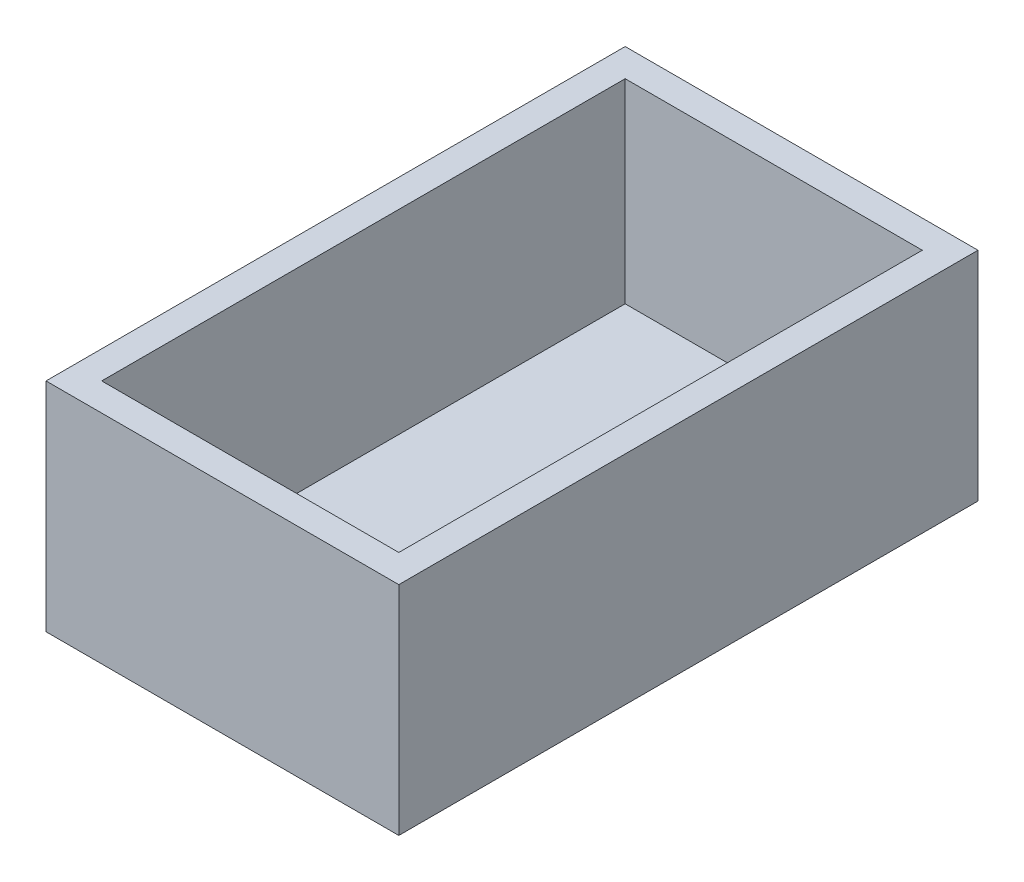
ISO-10303-21;
HEADER;
FILE_DESCRIPTION(('STEP AP214'),'2;1');
FILE_NAME('part.step','',(''),(''),'','','');
FILE_SCHEMA(('AUTOMOTIVE_DESIGN { 1 0 10303 214 1 1 1 1 }'));
ENDSEC;
DATA;
#1=APPLICATION_CONTEXT('core data for automotive mechanical design processes');
#2=APPLICATION_PROTOCOL_DEFINITION('international standard','automotive_design',2000,#1);
#3=PRODUCT_CONTEXT('',#1,'mechanical');
#4=PRODUCT('Part','Part','',(#3));
#5=PRODUCT_RELATED_PRODUCT_CATEGORY('part','',(#4));
#6=PRODUCT_DEFINITION_FORMATION('','',#4);
#7=PRODUCT_DEFINITION_CONTEXT('part definition',#1,'design');
#8=PRODUCT_DEFINITION('design','',#6,#7);
#9=PRODUCT_DEFINITION_SHAPE('','',#8);
#10=(LENGTH_UNIT() NAMED_UNIT(*) SI_UNIT(.MILLI.,.METRE.));
#11=(NAMED_UNIT(*) PLANE_ANGLE_UNIT() SI_UNIT($,.RADIAN.));
#12=(NAMED_UNIT(*) SI_UNIT($,.STERADIAN.) SOLID_ANGLE_UNIT());
#13=UNCERTAINTY_MEASURE_WITH_UNIT(LENGTH_MEASURE(1.E-05),#10,'distance_accuracy_value','');
#14=(GEOMETRIC_REPRESENTATION_CONTEXT(3) GLOBAL_UNCERTAINTY_ASSIGNED_CONTEXT((#13)) GLOBAL_UNIT_ASSIGNED_CONTEXT((#10,
#11,#12)) REPRESENTATION_CONTEXT('',''));
#15=CARTESIAN_POINT('',(0.,0.,0.));
#16=DIRECTION('',(0.,0.,1.));
#17=DIRECTION('',(1.,0.,0.));
#18=AXIS2_PLACEMENT_3D('',#15,#16,#17);
#19=CARTESIAN_POINT('',(0.,4.,0.));
#20=DIRECTION('',(1.,0.,0.));
#21=DIRECTION('',(0.,0.,-1.));
#22=AXIS2_PLACEMENT_3D('',#19,#20,#21);
#23=PLANE('',#22);
#24=DIRECTION('',(0.,0.,1.));
#25=VECTOR('',#24,1.);
#26=CARTESIAN_POINT('',(0.,0.,0.));
#27=LINE('',#26,#25);
#28=CARTESIAN_POINT('',(0.,0.,-103.98));
#29=VERTEX_POINT('',#28);
#30=CARTESIAN_POINT('',(0.,0.,0.));
#31=VERTEX_POINT('',#30);
#32=EDGE_CURVE('E173',#29,#31,#27,.T.);
#33=ORIENTED_EDGE('',*,*,#32,.T.);
#34=DIRECTION('',(0.,-1.,0.));
#35=VECTOR('',#34,1.);
#36=CARTESIAN_POINT('',(0.,4.,0.));
#37=LINE('',#36,#35);
#38=CARTESIAN_POINT('',(0.,39.,0.));
#39=VERTEX_POINT('',#38);
#40=EDGE_CURVE('E11',#39,#31,#37,.T.);
#41=ORIENTED_EDGE('',*,*,#40,.F.);
#42=DIRECTION('',(0.,0.,1.));
#43=VECTOR('',#42,1.);
#44=CARTESIAN_POINT('',(0.,39.,-103.98));
#45=LINE('',#44,#43);
#46=CARTESIAN_POINT('',(0.,39.,-103.98));
#47=VERTEX_POINT('',#46);
#48=EDGE_CURVE('E124',#47,#39,#45,.T.);
#49=ORIENTED_EDGE('',*,*,#48,.F.);
#50=DIRECTION('',(0.,-1.,0.));
#51=VECTOR('',#50,1.);
#52=CARTESIAN_POINT('',(0.,4.,-103.98));
#53=LINE('',#52,#51);
#54=EDGE_CURVE('E185',#47,#29,#53,.T.);
#55=ORIENTED_EDGE('',*,*,#54,.T.);
#56=EDGE_LOOP('',(#33,#41,#49,#55));
#57=FACE_BOUND('',#56,.T.);
#58=ADVANCED_FACE('F39',(#57),#23,.F.);
#59=CARTESIAN_POINT('',(0.,4.,0.));
#60=DIRECTION('',(0.,0.,-1.));
#61=DIRECTION('',(-1.,0.,0.));
#62=AXIS2_PLACEMENT_3D('',#59,#60,#61);
#63=PLANE('',#62);
#64=DIRECTION('',(1.,0.,0.));
#65=VECTOR('',#64,1.);
#66=CARTESIAN_POINT('',(0.,0.,0.));
#67=LINE('',#66,#65);
#68=CARTESIAN_POINT('',(63.34,0.,0.));
#69=VERTEX_POINT('',#68);
#70=EDGE_CURVE('E177',#31,#69,#67,.T.);
#71=ORIENTED_EDGE('',*,*,#70,.T.);
#72=DIRECTION('',(0.,-1.,0.));
#73=VECTOR('',#72,1.);
#74=CARTESIAN_POINT('',(63.34,4.,0.));
#75=LINE('',#74,#73);
#76=CARTESIAN_POINT('',(63.34,39.,0.));
#77=VERTEX_POINT('',#76);
#78=EDGE_CURVE('E47',#77,#69,#75,.T.);
#79=ORIENTED_EDGE('',*,*,#78,.F.);
#80=DIRECTION('',(1.,0.,0.));
#81=VECTOR('',#80,1.);
#82=CARTESIAN_POINT('',(0.,39.,0.));
#83=LINE('',#82,#81);
#84=EDGE_CURVE('E161',#39,#77,#83,.T.);
#85=ORIENTED_EDGE('',*,*,#84,.F.);
#86=ORIENTED_EDGE('',*,*,#40,.T.);
#87=EDGE_LOOP('',(#71,#79,#85,#86));
#88=FACE_BOUND('',#87,.T.);
#89=ADVANCED_FACE('F206',(#88),#63,.F.);
#90=CARTESIAN_POINT('',(63.34,4.,0.));
#91=DIRECTION('',(-1.,0.,0.));
#92=DIRECTION('',(0.,0.,1.));
#93=AXIS2_PLACEMENT_3D('',#90,#91,#92);
#94=PLANE('',#93);
#95=DIRECTION('',(0.,0.,-1.));
#96=VECTOR('',#95,1.);
#97=CARTESIAN_POINT('',(63.34,0.,0.));
#98=LINE('',#97,#96);
#99=CARTESIAN_POINT('',(63.34,0.,-103.98));
#100=VERTEX_POINT('',#99);
#101=EDGE_CURVE('E180',#69,#100,#98,.T.);
#102=ORIENTED_EDGE('',*,*,#101,.T.);
#103=DIRECTION('',(0.,-1.,0.));
#104=VECTOR('',#103,1.);
#105=CARTESIAN_POINT('',(63.34,4.,-103.98));
#106=LINE('',#105,#104);
#107=CARTESIAN_POINT('',(63.34,39.,-103.98));
#108=VERTEX_POINT('',#107);
#109=EDGE_CURVE('E188',#108,#100,#106,.T.);
#110=ORIENTED_EDGE('',*,*,#109,.F.);
#111=DIRECTION('',(0.,0.,-1.));
#112=VECTOR('',#111,1.);
#113=CARTESIAN_POINT('',(63.34,39.,-103.98));
#114=LINE('',#113,#112);
#115=EDGE_CURVE('E165',#77,#108,#114,.T.);
#116=ORIENTED_EDGE('',*,*,#115,.F.);
#117=ORIENTED_EDGE('',*,*,#78,.T.);
#118=EDGE_LOOP('',(#102,#110,#116,#117));
#119=FACE_BOUND('',#118,.T.);
#120=ADVANCED_FACE('F195',(#119),#94,.F.);
#121=CARTESIAN_POINT('',(0.,4.,-103.98));
#122=DIRECTION('',(0.,0.,1.));
#123=DIRECTION('',(1.,0.,0.));
#124=AXIS2_PLACEMENT_3D('',#121,#122,#123);
#125=PLANE('',#124);
#126=DIRECTION('',(-1.,0.,0.));
#127=VECTOR('',#126,1.);
#128=CARTESIAN_POINT('',(0.,0.,-103.98));
#129=LINE('',#128,#127);
#130=EDGE_CURVE('E62',#100,#29,#129,.T.);
#131=ORIENTED_EDGE('',*,*,#130,.T.);
#132=ORIENTED_EDGE('',*,*,#54,.F.);
#133=DIRECTION('',(-1.,0.,0.));
#134=VECTOR('',#133,1.);
#135=CARTESIAN_POINT('',(0.,39.,-103.98));
#136=LINE('',#135,#134);
#137=EDGE_CURVE('E169',#108,#47,#136,.T.);
#138=ORIENTED_EDGE('',*,*,#137,.F.);
#139=ORIENTED_EDGE('',*,*,#109,.T.);
#140=EDGE_LOOP('',(#131,#132,#138,#139));
#141=FACE_BOUND('',#140,.T.);
#142=ADVANCED_FACE('F204',(#141),#125,.F.);
#143=CARTESIAN_POINT('',(0.,0.,0.));
#144=DIRECTION('',(0.,-1.,0.));
#145=DIRECTION('',(0.,0.,-1.));
#146=AXIS2_PLACEMENT_3D('',#143,#144,#145);
#147=PLANE('',#146);
#148=ORIENTED_EDGE('',*,*,#32,.F.);
#149=ORIENTED_EDGE('',*,*,#130,.F.);
#150=ORIENTED_EDGE('',*,*,#101,.F.);
#151=ORIENTED_EDGE('',*,*,#70,.F.);
#152=EDGE_LOOP('',(#148,#149,#150,#151));
#153=FACE_BOUND('',#152,.T.);
#154=ADVANCED_FACE('F200',(#153),#147,.T.);
#155=CARTESIAN_POINT('',(0.,39.,0.));
#156=DIRECTION('',(0.,1.,0.));
#157=DIRECTION('',(0.,0.,1.));
#158=AXIS2_PLACEMENT_3D('',#155,#156,#157);
#159=PLANE('',#158);
#160=ORIENTED_EDGE('',*,*,#48,.T.);
#161=ORIENTED_EDGE('',*,*,#84,.T.);
#162=ORIENTED_EDGE('',*,*,#115,.T.);
#163=ORIENTED_EDGE('',*,*,#137,.T.);
#164=EDGE_LOOP('',(#160,#161,#162,#163));
#165=FACE_BOUND('',#164,.T.);
#166=DIRECTION('',(0.,0.,1.));
#167=VECTOR('',#166,1.);
#168=CARTESIAN_POINT('',(5.,39.,-98.98));
#169=LINE('',#168,#167);
#170=CARTESIAN_POINT('',(5.,39.,-98.98));
#171=VERTEX_POINT('',#170);
#172=CARTESIAN_POINT('',(5.,39.,-5.));
#173=VERTEX_POINT('',#172);
#174=EDGE_CURVE('E115',#171,#173,#169,.T.);
#175=ORIENTED_EDGE('',*,*,#174,.F.);
#176=DIRECTION('',(-1.,0.,0.));
#177=VECTOR('',#176,1.);
#178=CARTESIAN_POINT('',(5.,39.,-98.98));
#179=LINE('',#178,#177);
#180=CARTESIAN_POINT('',(58.34,39.,-98.98));
#181=VERTEX_POINT('',#180);
#182=EDGE_CURVE('E106',#181,#171,#179,.T.);
#183=ORIENTED_EDGE('',*,*,#182,.F.);
#184=DIRECTION('',(0.,0.,-1.));
#185=VECTOR('',#184,1.);
#186=CARTESIAN_POINT('',(58.34,39.,-98.98));
#187=LINE('',#186,#185);
#188=CARTESIAN_POINT('',(58.34,39.,-5.));
#189=VERTEX_POINT('',#188);
#190=EDGE_CURVE('E134',#189,#181,#187,.T.);
#191=ORIENTED_EDGE('',*,*,#190,.F.);
#192=DIRECTION('',(1.,0.,0.));
#193=VECTOR('',#192,1.);
#194=CARTESIAN_POINT('',(5.,39.,-5.));
#195=LINE('',#194,#193);
#196=EDGE_CURVE('E130',#173,#189,#195,.T.);
#197=ORIENTED_EDGE('',*,*,#196,.F.);
#198=EDGE_LOOP('',(#175,#183,#191,#197));
#199=FACE_BOUND('',#198,.T.);
#200=ADVANCED_FACE('F128',(#165,#199),#159,.T.);
#201=CARTESIAN_POINT('',(5.,39.,-98.98));
#202=DIRECTION('',(0.,0.,1.));
#203=DIRECTION('',(1.,0.,0.));
#204=AXIS2_PLACEMENT_3D('',#201,#202,#203);
#205=PLANE('',#204);
#206=DIRECTION('',(-1.,0.,0.));
#207=VECTOR('',#206,1.);
#208=CARTESIAN_POINT('',(5.,4.,-98.98));
#209=LINE('',#208,#207);
#210=CARTESIAN_POINT('',(58.34,4.,-98.98));
#211=VERTEX_POINT('',#210);
#212=CARTESIAN_POINT('',(5.,4.,-98.98));
#213=VERTEX_POINT('',#212);
#214=EDGE_CURVE('E139',#211,#213,#209,.T.);
#215=ORIENTED_EDGE('',*,*,#214,.F.);
#216=DIRECTION('',(0.,-1.,0.));
#217=VECTOR('',#216,1.);
#218=CARTESIAN_POINT('',(58.34,39.,-98.98));
#219=LINE('',#218,#217);
#220=EDGE_CURVE('E54',#181,#211,#219,.T.);
#221=ORIENTED_EDGE('',*,*,#220,.F.);
#222=ORIENTED_EDGE('',*,*,#182,.T.);
#223=DIRECTION('',(0.,-1.,0.));
#224=VECTOR('',#223,1.);
#225=CARTESIAN_POINT('',(5.,39.,-98.98));
#226=LINE('',#225,#224);
#227=EDGE_CURVE('E109',#171,#213,#226,.T.);
#228=ORIENTED_EDGE('',*,*,#227,.T.);
#229=EDGE_LOOP('',(#215,#221,#222,#228));
#230=FACE_BOUND('',#229,.T.);
#231=ADVANCED_FACE('F108',(#230),#205,.T.);
#232=CARTESIAN_POINT('',(5.,39.,-98.98));
#233=DIRECTION('',(1.,0.,0.));
#234=DIRECTION('',(0.,0.,-1.));
#235=AXIS2_PLACEMENT_3D('',#232,#233,#234);
#236=PLANE('',#235);
#237=DIRECTION('',(0.,0.,1.));
#238=VECTOR('',#237,1.);
#239=CARTESIAN_POINT('',(5.,4.,-98.98));
#240=LINE('',#239,#238);
#241=CARTESIAN_POINT('',(5.,4.,-5.));
#242=VERTEX_POINT('',#241);
#243=EDGE_CURVE('E122',#213,#242,#240,.T.);
#244=ORIENTED_EDGE('',*,*,#243,.F.);
#245=ORIENTED_EDGE('',*,*,#227,.F.);
#246=ORIENTED_EDGE('',*,*,#174,.T.);
#247=DIRECTION('',(0.,-1.,0.));
#248=VECTOR('',#247,1.);
#249=CARTESIAN_POINT('',(5.,39.,-5.));
#250=LINE('',#249,#248);
#251=EDGE_CURVE('E125',#173,#242,#250,.T.);
#252=ORIENTED_EDGE('',*,*,#251,.T.);
#253=EDGE_LOOP('',(#244,#245,#246,#252));
#254=FACE_BOUND('',#253,.T.);
#255=ADVANCED_FACE('F119',(#254),#236,.T.);
#256=CARTESIAN_POINT('',(5.,39.,-5.));
#257=DIRECTION('',(0.,0.,-1.));
#258=DIRECTION('',(-1.,0.,0.));
#259=AXIS2_PLACEMENT_3D('',#256,#257,#258);
#260=PLANE('',#259);
#261=DIRECTION('',(1.,0.,0.));
#262=VECTOR('',#261,1.);
#263=CARTESIAN_POINT('',(5.,4.,-5.));
#264=LINE('',#263,#262);
#265=CARTESIAN_POINT('',(58.34,4.,-5.));
#266=VERTEX_POINT('',#265);
#267=EDGE_CURVE('E144',#242,#266,#264,.T.);
#268=ORIENTED_EDGE('',*,*,#267,.F.);
#269=ORIENTED_EDGE('',*,*,#251,.F.);
#270=ORIENTED_EDGE('',*,*,#196,.T.);
#271=DIRECTION('',(0.,-1.,0.));
#272=VECTOR('',#271,1.);
#273=CARTESIAN_POINT('',(58.34,39.,-5.));
#274=LINE('',#273,#272);
#275=EDGE_CURVE('E153',#189,#266,#274,.T.);
#276=ORIENTED_EDGE('',*,*,#275,.T.);
#277=EDGE_LOOP('',(#268,#269,#270,#276));
#278=FACE_BOUND('',#277,.T.);
#279=ADVANCED_FACE('F229',(#278),#260,.T.);
#280=CARTESIAN_POINT('',(58.34,39.,-98.98));
#281=DIRECTION('',(-1.,0.,0.));
#282=DIRECTION('',(0.,0.,1.));
#283=AXIS2_PLACEMENT_3D('',#280,#281,#282);
#284=PLANE('',#283);
#285=DIRECTION('',(0.,0.,-1.));
#286=VECTOR('',#285,1.);
#287=CARTESIAN_POINT('',(58.34,4.,-98.98));
#288=LINE('',#287,#286);
#289=EDGE_CURVE('E116',#266,#211,#288,.T.);
#290=ORIENTED_EDGE('',*,*,#289,.F.);
#291=ORIENTED_EDGE('',*,*,#275,.F.);
#292=ORIENTED_EDGE('',*,*,#190,.T.);
#293=ORIENTED_EDGE('',*,*,#220,.T.);
#294=EDGE_LOOP('',(#290,#291,#292,#293));
#295=FACE_BOUND('',#294,.T.);
#296=ADVANCED_FACE('F221',(#295),#284,.T.);
#297=CARTESIAN_POINT('',(0.,4.,0.));
#298=DIRECTION('',(0.,-1.,0.));
#299=DIRECTION('',(0.,0.,-1.));
#300=AXIS2_PLACEMENT_3D('',#297,#298,#299);
#301=PLANE('',#300);
#302=ORIENTED_EDGE('',*,*,#289,.T.);
#303=ORIENTED_EDGE('',*,*,#214,.T.);
#304=ORIENTED_EDGE('',*,*,#243,.T.);
#305=ORIENTED_EDGE('',*,*,#267,.T.);
#306=EDGE_LOOP('',(#302,#303,#304,#305));
#307=FACE_BOUND('',#306,.T.);
#308=ADVANCED_FACE('F218',(#307),#301,.F.);
#309=CLOSED_SHELL('',(#58,#89,#120,#142,#154,#200,#231,#255,#279,#296,#308));
#310=MANIFOLD_SOLID_BREP('B2',#309);
#311=ADVANCED_BREP_SHAPE_REPRESENTATION('',(#18,#310),#14);
#312=SHAPE_DEFINITION_REPRESENTATION(#9,#311);
ENDSEC;
END-ISO-10303-21;
